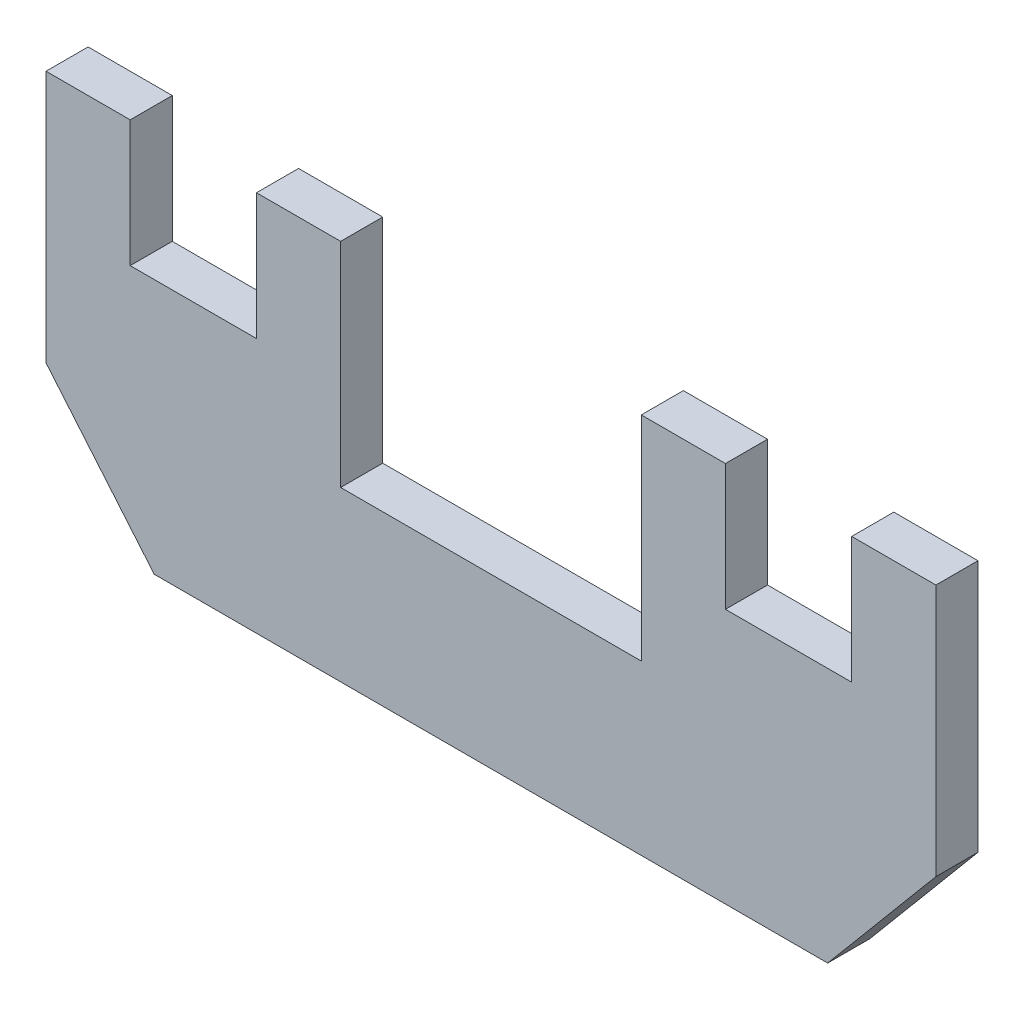
ISO-10303-21;
HEADER;
FILE_DESCRIPTION(('STEP AP214'),'2;1');
FILE_NAME('part.step','',(''),(''),'','','');
FILE_SCHEMA(('AUTOMOTIVE_DESIGN { 1 0 10303 214 1 1 1 1 }'));
ENDSEC;
DATA;
#1=APPLICATION_CONTEXT('core data for automotive mechanical design processes');
#2=APPLICATION_PROTOCOL_DEFINITION('international standard','automotive_design',2000,#1);
#3=PRODUCT_CONTEXT('',#1,'mechanical');
#4=PRODUCT('Part','Part','',(#3));
#5=PRODUCT_RELATED_PRODUCT_CATEGORY('part','',(#4));
#6=PRODUCT_DEFINITION_FORMATION('','',#4);
#7=PRODUCT_DEFINITION_CONTEXT('part definition',#1,'design');
#8=PRODUCT_DEFINITION('design','',#6,#7);
#9=PRODUCT_DEFINITION_SHAPE('','',#8);
#10=(LENGTH_UNIT() NAMED_UNIT(*) SI_UNIT(.MILLI.,.METRE.));
#11=(NAMED_UNIT(*) PLANE_ANGLE_UNIT() SI_UNIT($,.RADIAN.));
#12=(NAMED_UNIT(*) SI_UNIT($,.STERADIAN.) SOLID_ANGLE_UNIT());
#13=UNCERTAINTY_MEASURE_WITH_UNIT(LENGTH_MEASURE(1.E-05),#10,'distance_accuracy_value','');
#14=(GEOMETRIC_REPRESENTATION_CONTEXT(3) GLOBAL_UNCERTAINTY_ASSIGNED_CONTEXT((#13)) GLOBAL_UNIT_ASSIGNED_CONTEXT((#10,
#11,#12)) REPRESENTATION_CONTEXT('',''));
#15=CARTESIAN_POINT('',(0.,0.,0.));
#16=DIRECTION('',(0.,0.,1.));
#17=DIRECTION('',(1.,0.,0.));
#18=AXIS2_PLACEMENT_3D('',#15,#16,#17);
#19=CARTESIAN_POINT('',(50.8,0.,6.35));
#20=DIRECTION('',(-0.766044443118979,0.642787609686538,0.));
#21=DIRECTION('',(-0.642787609686538,-0.766044443118979,0.));
#22=AXIS2_PLACEMENT_3D('',#19,#20,#21);
#23=PLANE('',#22);
#24=DIRECTION('',(0.642787609686538,0.766044443118979,0.));
#25=VECTOR('',#24,1.);
#26=CARTESIAN_POINT('',(50.8,0.,0.));
#27=LINE('',#26,#25);
#28=CARTESIAN_POINT('',(50.8,0.,0.));
#29=VERTEX_POINT('',#28);
#30=CARTESIAN_POINT('',(67.1268052860381,19.4575288552221,0.));
#31=VERTEX_POINT('',#30);
#32=EDGE_CURVE('E200',#29,#31,#27,.T.);
#33=ORIENTED_EDGE('',*,*,#32,.T.);
#34=DIRECTION('',(0.,0.,-1.));
#35=VECTOR('',#34,1.);
#36=CARTESIAN_POINT('',(67.1268052860381,19.4575288552221,6.35));
#37=LINE('',#36,#35);
#38=CARTESIAN_POINT('',(67.1268052860381,19.4575288552221,6.35));
#39=VERTEX_POINT('',#38);
#40=EDGE_CURVE('E11',#39,#31,#37,.T.);
#41=ORIENTED_EDGE('',*,*,#40,.F.);
#42=DIRECTION('',(0.642787609686538,0.766044443118979,0.));
#43=VECTOR('',#42,1.);
#44=CARTESIAN_POINT('',(50.8,0.,6.35));
#45=LINE('',#44,#43);
#46=CARTESIAN_POINT('',(50.8,0.,6.35));
#47=VERTEX_POINT('',#46);
#48=EDGE_CURVE('E252',#47,#39,#45,.T.);
#49=ORIENTED_EDGE('',*,*,#48,.F.);
#50=DIRECTION('',(0.,0.,-1.));
#51=VECTOR('',#50,1.);
#52=CARTESIAN_POINT('',(50.8,0.,6.35));
#53=LINE('',#52,#51);
#54=EDGE_CURVE('E196',#47,#29,#53,.T.);
#55=ORIENTED_EDGE('',*,*,#54,.T.);
#56=EDGE_LOOP('',(#33,#41,#49,#55));
#57=FACE_BOUND('',#56,.T.);
#58=ADVANCED_FACE('F39',(#57),#23,.F.);
#59=CARTESIAN_POINT('',(67.1268052860381,19.4575288552221,6.35));
#60=DIRECTION('',(-1.,0.,0.));
#61=DIRECTION('',(0.,-1.,0.));
#62=AXIS2_PLACEMENT_3D('',#59,#60,#61);
#63=PLANE('',#62);
#64=DIRECTION('',(0.,1.,0.));
#65=VECTOR('',#64,1.);
#66=CARTESIAN_POINT('',(67.1268052860381,19.4575288552221,0.));
#67=LINE('',#66,#65);
#68=CARTESIAN_POINT('',(67.126805286038,57.5575288552221,0.));
#69=VERTEX_POINT('',#68);
#70=EDGE_CURVE('E204',#31,#69,#67,.T.);
#71=ORIENTED_EDGE('',*,*,#70,.T.);
#72=DIRECTION('',(0.,0.,-1.));
#73=VECTOR('',#72,1.);
#74=CARTESIAN_POINT('',(67.126805286038,57.5575288552221,6.35));
#75=LINE('',#74,#73);
#76=CARTESIAN_POINT('',(67.126805286038,57.5575288552221,6.35));
#77=VERTEX_POINT('',#76);
#78=EDGE_CURVE('E48',#77,#69,#75,.T.);
#79=ORIENTED_EDGE('',*,*,#78,.F.);
#80=DIRECTION('',(0.,1.,0.));
#81=VECTOR('',#80,1.);
#82=CARTESIAN_POINT('',(67.1268052860381,19.4575288552221,6.35));
#83=LINE('',#82,#81);
#84=EDGE_CURVE('E129',#39,#77,#83,.T.);
#85=ORIENTED_EDGE('',*,*,#84,.F.);
#86=ORIENTED_EDGE('',*,*,#40,.T.);
#87=EDGE_LOOP('',(#71,#79,#85,#86));
#88=FACE_BOUND('',#87,.T.);
#89=ADVANCED_FACE('F388',(#88),#63,.F.);
#90=CARTESIAN_POINT('',(67.126805286038,57.5575288552221,6.35));
#91=DIRECTION('',(0.,-1.,0.));
#92=DIRECTION('',(0.,0.,-1.));
#93=AXIS2_PLACEMENT_3D('',#90,#91,#92);
#94=PLANE('',#93);
#95=DIRECTION('',(-1.,0.,0.));
#96=VECTOR('',#95,1.);
#97=CARTESIAN_POINT('',(67.126805286038,57.5575288552221,0.));
#98=LINE('',#97,#96);
#99=CARTESIAN_POINT('',(54.426805286038,57.5575288552221,0.));
#100=VERTEX_POINT('',#99);
#101=EDGE_CURVE('E207',#69,#100,#98,.T.);
#102=ORIENTED_EDGE('',*,*,#101,.T.);
#103=DIRECTION('',(0.,0.,-1.));
#104=VECTOR('',#103,1.);
#105=CARTESIAN_POINT('',(54.426805286038,57.5575288552221,6.35));
#106=LINE('',#105,#104);
#107=CARTESIAN_POINT('',(54.426805286038,57.5575288552221,6.35));
#108=VERTEX_POINT('',#107);
#109=EDGE_CURVE('E303',#108,#100,#106,.T.);
#110=ORIENTED_EDGE('',*,*,#109,.F.);
#111=DIRECTION('',(-1.,0.,0.));
#112=VECTOR('',#111,1.);
#113=CARTESIAN_POINT('',(67.126805286038,57.5575288552221,6.35));
#114=LINE('',#113,#112);
#115=EDGE_CURVE('E313',#77,#108,#114,.T.);
#116=ORIENTED_EDGE('',*,*,#115,.F.);
#117=ORIENTED_EDGE('',*,*,#78,.T.);
#118=EDGE_LOOP('',(#102,#110,#116,#117));
#119=FACE_BOUND('',#118,.T.);
#120=ADVANCED_FACE('F311',(#119),#94,.F.);
#121=CARTESIAN_POINT('',(54.426805286038,57.5575288552221,6.35));
#122=DIRECTION('',(1.,0.,0.));
#123=DIRECTION('',(0.,1.,0.));
#124=AXIS2_PLACEMENT_3D('',#121,#122,#123);
#125=PLANE('',#124);
#126=DIRECTION('',(0.,-1.,0.));
#127=VECTOR('',#126,1.);
#128=CARTESIAN_POINT('',(54.426805286038,57.5575288552221,0.));
#129=LINE('',#128,#127);
#130=CARTESIAN_POINT('',(54.426805286038,38.5075288552221,0.));
#131=VERTEX_POINT('',#130);
#132=EDGE_CURVE('E210',#100,#131,#129,.T.);
#133=ORIENTED_EDGE('',*,*,#132,.T.);
#134=DIRECTION('',(0.,0.,-1.));
#135=VECTOR('',#134,1.);
#136=CARTESIAN_POINT('',(54.426805286038,38.5075288552221,6.35));
#137=LINE('',#136,#135);
#138=CARTESIAN_POINT('',(54.426805286038,38.5075288552221,6.35));
#139=VERTEX_POINT('',#138);
#140=EDGE_CURVE('E299',#139,#131,#137,.T.);
#141=ORIENTED_EDGE('',*,*,#140,.F.);
#142=DIRECTION('',(0.,-1.,0.));
#143=VECTOR('',#142,1.);
#144=CARTESIAN_POINT('',(54.426805286038,57.5575288552221,6.35));
#145=LINE('',#144,#143);
#146=EDGE_CURVE('E332',#108,#139,#145,.T.);
#147=ORIENTED_EDGE('',*,*,#146,.F.);
#148=ORIENTED_EDGE('',*,*,#109,.T.);
#149=EDGE_LOOP('',(#133,#141,#147,#148));
#150=FACE_BOUND('',#149,.T.);
#151=ADVANCED_FACE('F322',(#150),#125,.F.);
#152=CARTESIAN_POINT('',(54.426805286038,38.5075288552221,6.35));
#153=DIRECTION('',(0.,-1.,0.));
#154=DIRECTION('',(0.,0.,-1.));
#155=AXIS2_PLACEMENT_3D('',#152,#153,#154);
#156=PLANE('',#155);
#157=DIRECTION('',(-1.,0.,0.));
#158=VECTOR('',#157,1.);
#159=CARTESIAN_POINT('',(54.426805286038,38.5075288552221,0.));
#160=LINE('',#159,#158);
#161=CARTESIAN_POINT('',(35.376805286038,38.5075288552221,0.));
#162=VERTEX_POINT('',#161);
#163=EDGE_CURVE('E213',#131,#162,#160,.T.);
#164=ORIENTED_EDGE('',*,*,#163,.T.);
#165=DIRECTION('',(0.,0.,-1.));
#166=VECTOR('',#165,1.);
#167=CARTESIAN_POINT('',(35.376805286038,38.5075288552221,6.35));
#168=LINE('',#167,#166);
#169=CARTESIAN_POINT('',(35.376805286038,38.5075288552221,6.35));
#170=VERTEX_POINT('',#169);
#171=EDGE_CURVE('E295',#170,#162,#168,.T.);
#172=ORIENTED_EDGE('',*,*,#171,.F.);
#173=DIRECTION('',(-1.,0.,0.));
#174=VECTOR('',#173,1.);
#175=CARTESIAN_POINT('',(54.426805286038,38.5075288552221,6.35));
#176=LINE('',#175,#174);
#177=EDGE_CURVE('E328',#139,#170,#176,.T.);
#178=ORIENTED_EDGE('',*,*,#177,.F.);
#179=ORIENTED_EDGE('',*,*,#140,.T.);
#180=EDGE_LOOP('',(#164,#172,#178,#179));
#181=FACE_BOUND('',#180,.T.);
#182=ADVANCED_FACE('F326',(#181),#156,.F.);
#183=CARTESIAN_POINT('',(35.376805286038,38.5075288552221,6.35));
#184=DIRECTION('',(-1.,0.,0.));
#185=DIRECTION('',(0.,0.,1.));
#186=AXIS2_PLACEMENT_3D('',#183,#184,#185);
#187=PLANE('',#186);
#188=DIRECTION('',(0.,1.,0.));
#189=VECTOR('',#188,1.);
#190=CARTESIAN_POINT('',(35.376805286038,38.5075288552221,0.));
#191=LINE('',#190,#189);
#192=CARTESIAN_POINT('',(35.376805286038,57.5575288552221,0.));
#193=VERTEX_POINT('',#192);
#194=EDGE_CURVE('E216',#162,#193,#191,.T.);
#195=ORIENTED_EDGE('',*,*,#194,.T.);
#196=DIRECTION('',(0.,0.,-1.));
#197=VECTOR('',#196,1.);
#198=CARTESIAN_POINT('',(35.376805286038,57.5575288552221,6.35));
#199=LINE('',#198,#197);
#200=CARTESIAN_POINT('',(35.376805286038,57.5575288552221,6.35));
#201=VERTEX_POINT('',#200);
#202=EDGE_CURVE('E291',#201,#193,#199,.T.);
#203=ORIENTED_EDGE('',*,*,#202,.F.);
#204=DIRECTION('',(0.,1.,0.));
#205=VECTOR('',#204,1.);
#206=CARTESIAN_POINT('',(35.376805286038,38.5075288552221,6.35));
#207=LINE('',#206,#205);
#208=EDGE_CURVE('E331',#170,#201,#207,.T.);
#209=ORIENTED_EDGE('',*,*,#208,.F.);
#210=ORIENTED_EDGE('',*,*,#171,.T.);
#211=EDGE_LOOP('',(#195,#203,#209,#210));
#212=FACE_BOUND('',#211,.T.);
#213=ADVANCED_FACE('F401',(#212),#187,.F.);
#214=CARTESIAN_POINT('',(35.376805286038,57.5575288552221,6.35));
#215=DIRECTION('',(0.,-1.,0.));
#216=DIRECTION('',(0.,0.,-1.));
#217=AXIS2_PLACEMENT_3D('',#214,#215,#216);
#218=PLANE('',#217);
#219=DIRECTION('',(-1.,0.,0.));
#220=VECTOR('',#219,1.);
#221=CARTESIAN_POINT('',(35.376805286038,57.5575288552221,0.));
#222=LINE('',#221,#220);
#223=CARTESIAN_POINT('',(22.676805286038,57.5575288552221,0.));
#224=VERTEX_POINT('',#223);
#225=EDGE_CURVE('E219',#193,#224,#222,.T.);
#226=ORIENTED_EDGE('',*,*,#225,.T.);
#227=DIRECTION('',(0.,0.,-1.));
#228=VECTOR('',#227,1.);
#229=CARTESIAN_POINT('',(22.676805286038,57.5575288552221,6.35));
#230=LINE('',#229,#228);
#231=CARTESIAN_POINT('',(22.676805286038,57.5575288552221,6.35));
#232=VERTEX_POINT('',#231);
#233=EDGE_CURVE('E287',#232,#224,#230,.T.);
#234=ORIENTED_EDGE('',*,*,#233,.F.);
#235=DIRECTION('',(-1.,0.,0.));
#236=VECTOR('',#235,1.);
#237=CARTESIAN_POINT('',(35.376805286038,57.5575288552221,6.35));
#238=LINE('',#237,#236);
#239=EDGE_CURVE('E336',#201,#232,#238,.T.);
#240=ORIENTED_EDGE('',*,*,#239,.F.);
#241=ORIENTED_EDGE('',*,*,#202,.T.);
#242=EDGE_LOOP('',(#226,#234,#240,#241));
#243=FACE_BOUND('',#242,.T.);
#244=ADVANCED_FACE('F404',(#243),#218,.F.);
#245=CARTESIAN_POINT('',(22.676805286038,57.5575288552221,6.35));
#246=DIRECTION('',(1.,0.,0.));
#247=DIRECTION('',(0.,1.,0.));
#248=AXIS2_PLACEMENT_3D('',#245,#246,#247);
#249=PLANE('',#248);
#250=DIRECTION('',(0.,-1.,0.));
#251=VECTOR('',#250,1.);
#252=CARTESIAN_POINT('',(22.676805286038,57.5575288552221,0.));
#253=LINE('',#252,#251);
#254=CARTESIAN_POINT('',(22.676805286038,25.4,0.));
#255=VERTEX_POINT('',#254);
#256=EDGE_CURVE('E222',#224,#255,#253,.T.);
#257=ORIENTED_EDGE('',*,*,#256,.T.);
#258=DIRECTION('',(0.,0.,-1.));
#259=VECTOR('',#258,1.);
#260=CARTESIAN_POINT('',(22.676805286038,25.4,6.35));
#261=LINE('',#260,#259);
#262=CARTESIAN_POINT('',(22.676805286038,25.4,6.35));
#263=VERTEX_POINT('',#262);
#264=EDGE_CURVE('E283',#263,#255,#261,.T.);
#265=ORIENTED_EDGE('',*,*,#264,.F.);
#266=DIRECTION('',(0.,-1.,0.));
#267=VECTOR('',#266,1.);
#268=CARTESIAN_POINT('',(22.676805286038,57.5575288552221,6.35));
#269=LINE('',#268,#267);
#270=EDGE_CURVE('E343',#232,#263,#269,.T.);
#271=ORIENTED_EDGE('',*,*,#270,.F.);
#272=ORIENTED_EDGE('',*,*,#233,.T.);
#273=EDGE_LOOP('',(#257,#265,#271,#272));
#274=FACE_BOUND('',#273,.T.);
#275=ADVANCED_FACE('F408',(#274),#249,.F.);
#276=CARTESIAN_POINT('',(22.676805286038,25.4,6.35));
#277=DIRECTION('',(0.,-1.,0.));
#278=DIRECTION('',(0.,0.,-1.));
#279=AXIS2_PLACEMENT_3D('',#276,#277,#278);
#280=PLANE('',#279);
#281=DIRECTION('',(-1.,0.,0.));
#282=VECTOR('',#281,1.);
#283=CARTESIAN_POINT('',(22.676805286038,25.4,0.));
#284=LINE('',#283,#282);
#285=CARTESIAN_POINT('',(-22.676805286038,25.4,0.));
#286=VERTEX_POINT('',#285);
#287=EDGE_CURVE('E225',#255,#286,#284,.T.);
#288=ORIENTED_EDGE('',*,*,#287,.T.);
#289=DIRECTION('',(0.,0.,-1.));
#290=VECTOR('',#289,1.);
#291=CARTESIAN_POINT('',(-22.676805286038,25.4,6.35));
#292=LINE('',#291,#290);
#293=CARTESIAN_POINT('',(-22.676805286038,25.4,6.35));
#294=VERTEX_POINT('',#293);
#295=EDGE_CURVE('E279',#294,#286,#292,.T.);
#296=ORIENTED_EDGE('',*,*,#295,.F.);
#297=DIRECTION('',(-1.,0.,0.));
#298=VECTOR('',#297,1.);
#299=CARTESIAN_POINT('',(22.676805286038,25.4,6.35));
#300=LINE('',#299,#298);
#301=EDGE_CURVE('E346',#263,#294,#300,.T.);
#302=ORIENTED_EDGE('',*,*,#301,.F.);
#303=ORIENTED_EDGE('',*,*,#264,.T.);
#304=EDGE_LOOP('',(#288,#296,#302,#303));
#305=FACE_BOUND('',#304,.T.);
#306=ADVANCED_FACE('F412',(#305),#280,.F.);
#307=CARTESIAN_POINT('',(-22.676805286038,57.5575288552221,6.35));
#308=DIRECTION('',(-1.,0.,0.));
#309=DIRECTION('',(0.,-1.,0.));
#310=AXIS2_PLACEMENT_3D('',#307,#308,#309);
#311=PLANE('',#310);
#312=DIRECTION('',(0.,1.,0.));
#313=VECTOR('',#312,1.);
#314=CARTESIAN_POINT('',(-22.676805286038,57.5575288552221,0.));
#315=LINE('',#314,#313);
#316=CARTESIAN_POINT('',(-22.676805286038,57.5575288552221,0.));
#317=VERTEX_POINT('',#316);
#318=EDGE_CURVE('E228',#286,#317,#315,.T.);
#319=ORIENTED_EDGE('',*,*,#318,.T.);
#320=DIRECTION('',(0.,0.,-1.));
#321=VECTOR('',#320,1.);
#322=CARTESIAN_POINT('',(-22.676805286038,57.5575288552221,6.35));
#323=LINE('',#322,#321);
#324=CARTESIAN_POINT('',(-22.676805286038,57.5575288552221,6.35));
#325=VERTEX_POINT('',#324);
#326=EDGE_CURVE('E275',#325,#317,#323,.T.);
#327=ORIENTED_EDGE('',*,*,#326,.F.);
#328=DIRECTION('',(0.,1.,0.));
#329=VECTOR('',#328,1.);
#330=CARTESIAN_POINT('',(-22.676805286038,57.5575288552221,6.35));
#331=LINE('',#330,#329);
#332=EDGE_CURVE('E349',#294,#325,#331,.T.);
#333=ORIENTED_EDGE('',*,*,#332,.F.);
#334=ORIENTED_EDGE('',*,*,#295,.T.);
#335=EDGE_LOOP('',(#319,#327,#333,#334));
#336=FACE_BOUND('',#335,.T.);
#337=ADVANCED_FACE('F416',(#336),#311,.F.);
#338=CARTESIAN_POINT('',(-35.376805286038,57.5575288552221,6.35));
#339=DIRECTION('',(0.,-1.,0.));
#340=DIRECTION('',(0.,0.,-1.));
#341=AXIS2_PLACEMENT_3D('',#338,#339,#340);
#342=PLANE('',#341);
#343=DIRECTION('',(-1.,0.,0.));
#344=VECTOR('',#343,1.);
#345=CARTESIAN_POINT('',(-35.376805286038,57.5575288552221,0.));
#346=LINE('',#345,#344);
#347=CARTESIAN_POINT('',(-35.376805286038,57.5575288552221,0.));
#348=VERTEX_POINT('',#347);
#349=EDGE_CURVE('E231',#317,#348,#346,.T.);
#350=ORIENTED_EDGE('',*,*,#349,.T.);
#351=DIRECTION('',(0.,0.,-1.));
#352=VECTOR('',#351,1.);
#353=CARTESIAN_POINT('',(-35.376805286038,57.5575288552221,6.35));
#354=LINE('',#353,#352);
#355=CARTESIAN_POINT('',(-35.376805286038,57.5575288552221,6.35));
#356=VERTEX_POINT('',#355);
#357=EDGE_CURVE('E271',#356,#348,#354,.T.);
#358=ORIENTED_EDGE('',*,*,#357,.F.);
#359=DIRECTION('',(-1.,0.,0.));
#360=VECTOR('',#359,1.);
#361=CARTESIAN_POINT('',(-35.376805286038,57.5575288552221,6.35));
#362=LINE('',#361,#360);
#363=EDGE_CURVE('E352',#325,#356,#362,.T.);
#364=ORIENTED_EDGE('',*,*,#363,.F.);
#365=ORIENTED_EDGE('',*,*,#326,.T.);
#366=EDGE_LOOP('',(#350,#358,#364,#365));
#367=FACE_BOUND('',#366,.T.);
#368=ADVANCED_FACE('F420',(#367),#342,.F.);
#369=CARTESIAN_POINT('',(-35.376805286038,38.5075288552221,6.35));
#370=DIRECTION('',(1.,0.,0.));
#371=DIRECTION('',(0.,0.,-1.));
#372=AXIS2_PLACEMENT_3D('',#369,#370,#371);
#373=PLANE('',#372);
#374=DIRECTION('',(0.,-1.,0.));
#375=VECTOR('',#374,1.);
#376=CARTESIAN_POINT('',(-35.376805286038,38.5075288552221,0.));
#377=LINE('',#376,#375);
#378=CARTESIAN_POINT('',(-35.376805286038,38.5075288552221,0.));
#379=VERTEX_POINT('',#378);
#380=EDGE_CURVE('E234',#348,#379,#377,.T.);
#381=ORIENTED_EDGE('',*,*,#380,.T.);
#382=DIRECTION('',(0.,0.,-1.));
#383=VECTOR('',#382,1.);
#384=CARTESIAN_POINT('',(-35.376805286038,38.5075288552221,6.35));
#385=LINE('',#384,#383);
#386=CARTESIAN_POINT('',(-35.376805286038,38.5075288552221,6.35));
#387=VERTEX_POINT('',#386);
#388=EDGE_CURVE('E267',#387,#379,#385,.T.);
#389=ORIENTED_EDGE('',*,*,#388,.F.);
#390=DIRECTION('',(0.,-1.,0.));
#391=VECTOR('',#390,1.);
#392=CARTESIAN_POINT('',(-35.376805286038,38.5075288552221,6.35));
#393=LINE('',#392,#391);
#394=EDGE_CURVE('E355',#356,#387,#393,.T.);
#395=ORIENTED_EDGE('',*,*,#394,.F.);
#396=ORIENTED_EDGE('',*,*,#357,.T.);
#397=EDGE_LOOP('',(#381,#389,#395,#396));
#398=FACE_BOUND('',#397,.T.);
#399=ADVANCED_FACE('F424',(#398),#373,.F.);
#400=CARTESIAN_POINT('',(-54.426805286038,38.5075288552221,6.35));
#401=DIRECTION('',(0.,-1.,0.));
#402=DIRECTION('',(0.,0.,-1.));
#403=AXIS2_PLACEMENT_3D('',#400,#401,#402);
#404=PLANE('',#403);
#405=DIRECTION('',(-1.,0.,0.));
#406=VECTOR('',#405,1.);
#407=CARTESIAN_POINT('',(-54.426805286038,38.5075288552221,0.));
#408=LINE('',#407,#406);
#409=CARTESIAN_POINT('',(-54.426805286038,38.5075288552221,0.));
#410=VERTEX_POINT('',#409);
#411=EDGE_CURVE('E237',#379,#410,#408,.T.);
#412=ORIENTED_EDGE('',*,*,#411,.T.);
#413=DIRECTION('',(0.,0.,-1.));
#414=VECTOR('',#413,1.);
#415=CARTESIAN_POINT('',(-54.426805286038,38.5075288552221,6.35));
#416=LINE('',#415,#414);
#417=CARTESIAN_POINT('',(-54.426805286038,38.5075288552221,6.35));
#418=VERTEX_POINT('',#417);
#419=EDGE_CURVE('E263',#418,#410,#416,.T.);
#420=ORIENTED_EDGE('',*,*,#419,.F.);
#421=DIRECTION('',(-1.,0.,0.));
#422=VECTOR('',#421,1.);
#423=CARTESIAN_POINT('',(-54.426805286038,38.5075288552221,6.35));
#424=LINE('',#423,#422);
#425=EDGE_CURVE('E358',#387,#418,#424,.T.);
#426=ORIENTED_EDGE('',*,*,#425,.F.);
#427=ORIENTED_EDGE('',*,*,#388,.T.);
#428=EDGE_LOOP('',(#412,#420,#426,#427));
#429=FACE_BOUND('',#428,.T.);
#430=ADVANCED_FACE('F428',(#429),#404,.F.);
#431=CARTESIAN_POINT('',(-54.426805286038,57.5575288552221,6.35));
#432=DIRECTION('',(-1.,0.,0.));
#433=DIRECTION('',(0.,-1.,0.));
#434=AXIS2_PLACEMENT_3D('',#431,#432,#433);
#435=PLANE('',#434);
#436=DIRECTION('',(0.,1.,0.));
#437=VECTOR('',#436,1.);
#438=CARTESIAN_POINT('',(-54.426805286038,57.5575288552221,0.));
#439=LINE('',#438,#437);
#440=CARTESIAN_POINT('',(-54.426805286038,57.5575288552221,0.));
#441=VERTEX_POINT('',#440);
#442=EDGE_CURVE('E240',#410,#441,#439,.T.);
#443=ORIENTED_EDGE('',*,*,#442,.T.);
#444=DIRECTION('',(0.,0.,-1.));
#445=VECTOR('',#444,1.);
#446=CARTESIAN_POINT('',(-54.426805286038,57.5575288552221,6.35));
#447=LINE('',#446,#445);
#448=CARTESIAN_POINT('',(-54.426805286038,57.5575288552221,6.35));
#449=VERTEX_POINT('',#448);
#450=EDGE_CURVE('E259',#449,#441,#447,.T.);
#451=ORIENTED_EDGE('',*,*,#450,.F.);
#452=DIRECTION('',(0.,1.,0.));
#453=VECTOR('',#452,1.);
#454=CARTESIAN_POINT('',(-54.426805286038,57.5575288552221,6.35));
#455=LINE('',#454,#453);
#456=EDGE_CURVE('E361',#418,#449,#455,.T.);
#457=ORIENTED_EDGE('',*,*,#456,.F.);
#458=ORIENTED_EDGE('',*,*,#419,.T.);
#459=EDGE_LOOP('',(#443,#451,#457,#458));
#460=FACE_BOUND('',#459,.T.);
#461=ADVANCED_FACE('F369',(#460),#435,.F.);
#462=CARTESIAN_POINT('',(-67.126805286038,57.5575288552221,6.35));
#463=DIRECTION('',(0.,-1.,0.));
#464=DIRECTION('',(0.,0.,-1.));
#465=AXIS2_PLACEMENT_3D('',#462,#463,#464);
#466=PLANE('',#465);
#467=DIRECTION('',(-1.,0.,0.));
#468=VECTOR('',#467,1.);
#469=CARTESIAN_POINT('',(-67.126805286038,57.5575288552221,0.));
#470=LINE('',#469,#468);
#471=CARTESIAN_POINT('',(-67.126805286038,57.5575288552221,0.));
#472=VERTEX_POINT('',#471);
#473=EDGE_CURVE('E243',#441,#472,#470,.T.);
#474=ORIENTED_EDGE('',*,*,#473,.T.);
#475=DIRECTION('',(0.,0.,-1.));
#476=VECTOR('',#475,1.);
#477=CARTESIAN_POINT('',(-67.126805286038,57.5575288552221,6.35));
#478=LINE('',#477,#476);
#479=CARTESIAN_POINT('',(-67.126805286038,57.5575288552221,6.35));
#480=VERTEX_POINT('',#479);
#481=EDGE_CURVE('E189',#480,#472,#478,.T.);
#482=ORIENTED_EDGE('',*,*,#481,.F.);
#483=DIRECTION('',(-1.,0.,0.));
#484=VECTOR('',#483,1.);
#485=CARTESIAN_POINT('',(-67.126805286038,57.5575288552221,6.35));
#486=LINE('',#485,#484);
#487=EDGE_CURVE('E178',#449,#480,#486,.T.);
#488=ORIENTED_EDGE('',*,*,#487,.F.);
#489=ORIENTED_EDGE('',*,*,#450,.T.);
#490=EDGE_LOOP('',(#474,#482,#488,#489));
#491=FACE_BOUND('',#490,.T.);
#492=ADVANCED_FACE('F373',(#491),#466,.F.);
#493=CARTESIAN_POINT('',(-67.1268052860381,19.4575288552221,6.35));
#494=DIRECTION('',(1.,0.,0.));
#495=DIRECTION('',(0.,1.,0.));
#496=AXIS2_PLACEMENT_3D('',#493,#494,#495);
#497=PLANE('',#496);
#498=DIRECTION('',(0.,-1.,0.));
#499=VECTOR('',#498,1.);
#500=CARTESIAN_POINT('',(-67.1268052860381,19.4575288552221,0.));
#501=LINE('',#500,#499);
#502=CARTESIAN_POINT('',(-67.1268052860381,19.4575288552221,0.));
#503=VERTEX_POINT('',#502);
#504=EDGE_CURVE('E187',#472,#503,#501,.T.);
#505=ORIENTED_EDGE('',*,*,#504,.T.);
#506=DIRECTION('',(0.,0.,-1.));
#507=VECTOR('',#506,1.);
#508=CARTESIAN_POINT('',(-67.1268052860381,19.4575288552221,6.35));
#509=LINE('',#508,#507);
#510=CARTESIAN_POINT('',(-67.1268052860381,19.4575288552221,6.35));
#511=VERTEX_POINT('',#510);
#512=EDGE_CURVE('E184',#511,#503,#509,.T.);
#513=ORIENTED_EDGE('',*,*,#512,.F.);
#514=DIRECTION('',(0.,-1.,0.));
#515=VECTOR('',#514,1.);
#516=CARTESIAN_POINT('',(-67.1268052860381,19.4575288552221,6.35));
#517=LINE('',#516,#515);
#518=EDGE_CURVE('E172',#480,#511,#517,.T.);
#519=ORIENTED_EDGE('',*,*,#518,.F.);
#520=ORIENTED_EDGE('',*,*,#481,.T.);
#521=EDGE_LOOP('',(#505,#513,#519,#520));
#522=FACE_BOUND('',#521,.T.);
#523=ADVANCED_FACE('F185',(#522),#497,.F.);
#524=CARTESIAN_POINT('',(-50.8,0.,6.35));
#525=DIRECTION('',(0.766044443118979,0.642787609686538,0.));
#526=DIRECTION('',(-0.642787609686538,0.766044443118979,0.));
#527=AXIS2_PLACEMENT_3D('',#524,#525,#526);
#528=PLANE('',#527);
#529=DIRECTION('',(0.642787609686538,-0.766044443118979,0.));
#530=VECTOR('',#529,1.);
#531=CARTESIAN_POINT('',(-50.8,0.,0.));
#532=LINE('',#531,#530);
#533=CARTESIAN_POINT('',(-50.8,0.,0.));
#534=VERTEX_POINT('',#533);
#535=EDGE_CURVE('E115',#503,#534,#532,.T.);
#536=ORIENTED_EDGE('',*,*,#535,.T.);
#537=DIRECTION('',(0.,0.,-1.));
#538=VECTOR('',#537,1.);
#539=CARTESIAN_POINT('',(-50.8,0.,6.35));
#540=LINE('',#539,#538);
#541=CARTESIAN_POINT('',(-50.8,0.,6.35));
#542=VERTEX_POINT('',#541);
#543=EDGE_CURVE('E190',#542,#534,#540,.T.);
#544=ORIENTED_EDGE('',*,*,#543,.F.);
#545=DIRECTION('',(0.642787609686538,-0.766044443118979,0.));
#546=VECTOR('',#545,1.);
#547=CARTESIAN_POINT('',(-50.8,0.,6.35));
#548=LINE('',#547,#546);
#549=EDGE_CURVE('E176',#511,#542,#548,.T.);
#550=ORIENTED_EDGE('',*,*,#549,.F.);
#551=ORIENTED_EDGE('',*,*,#512,.T.);
#552=EDGE_LOOP('',(#536,#544,#550,#551));
#553=FACE_BOUND('',#552,.T.);
#554=ADVANCED_FACE('F192',(#553),#528,.F.);
#555=CARTESIAN_POINT('',(-50.8,0.,6.35));
#556=DIRECTION('',(0.,1.,0.));
#557=DIRECTION('',(0.,0.,1.));
#558=AXIS2_PLACEMENT_3D('',#555,#556,#557);
#559=PLANE('',#558);
#560=DIRECTION('',(1.,0.,0.));
#561=VECTOR('',#560,1.);
#562=CARTESIAN_POINT('',(-50.8,0.,0.));
#563=LINE('',#562,#561);
#564=EDGE_CURVE('E121',#534,#29,#563,.T.);
#565=ORIENTED_EDGE('',*,*,#564,.T.);
#566=ORIENTED_EDGE('',*,*,#54,.F.);
#567=DIRECTION('',(1.,0.,0.));
#568=VECTOR('',#567,1.);
#569=CARTESIAN_POINT('',(-50.8,0.,6.35));
#570=LINE('',#569,#568);
#571=EDGE_CURVE('E56',#542,#47,#570,.T.);
#572=ORIENTED_EDGE('',*,*,#571,.F.);
#573=ORIENTED_EDGE('',*,*,#543,.T.);
#574=EDGE_LOOP('',(#565,#566,#572,#573));
#575=FACE_BOUND('',#574,.T.);
#576=ADVANCED_FACE('F377',(#575),#559,.F.);
#577=CARTESIAN_POINT('',(0.,0.,6.35));
#578=DIRECTION('',(0.,0.,1.));
#579=DIRECTION('',(1.,0.,0.));
#580=AXIS2_PLACEMENT_3D('',#577,#578,#579);
#581=PLANE('',#580);
#582=ORIENTED_EDGE('',*,*,#48,.T.);
#583=ORIENTED_EDGE('',*,*,#84,.T.);
#584=ORIENTED_EDGE('',*,*,#115,.T.);
#585=ORIENTED_EDGE('',*,*,#146,.T.);
#586=ORIENTED_EDGE('',*,*,#177,.T.);
#587=ORIENTED_EDGE('',*,*,#208,.T.);
#588=ORIENTED_EDGE('',*,*,#239,.T.);
#589=ORIENTED_EDGE('',*,*,#270,.T.);
#590=ORIENTED_EDGE('',*,*,#301,.T.);
#591=ORIENTED_EDGE('',*,*,#332,.T.);
#592=ORIENTED_EDGE('',*,*,#363,.T.);
#593=ORIENTED_EDGE('',*,*,#394,.T.);
#594=ORIENTED_EDGE('',*,*,#425,.T.);
#595=ORIENTED_EDGE('',*,*,#456,.T.);
#596=ORIENTED_EDGE('',*,*,#487,.T.);
#597=ORIENTED_EDGE('',*,*,#518,.T.);
#598=ORIENTED_EDGE('',*,*,#549,.T.);
#599=ORIENTED_EDGE('',*,*,#571,.T.);
#600=EDGE_LOOP('',(#582,#583,#584,#585,#586,#587,#588,#589,#590,#591,#592,#593,#594,#595,#596,
#597,#598,#599));
#601=FACE_BOUND('',#600,.T.);
#602=ADVANCED_FACE('F174',(#601),#581,.T.);
#603=CARTESIAN_POINT('',(0.,0.,0.));
#604=DIRECTION('',(0.,0.,1.));
#605=DIRECTION('',(1.,0.,0.));
#606=AXIS2_PLACEMENT_3D('',#603,#604,#605);
#607=PLANE('',#606);
#608=ORIENTED_EDGE('',*,*,#32,.F.);
#609=ORIENTED_EDGE('',*,*,#564,.F.);
#610=ORIENTED_EDGE('',*,*,#535,.F.);
#611=ORIENTED_EDGE('',*,*,#504,.F.);
#612=ORIENTED_EDGE('',*,*,#473,.F.);
#613=ORIENTED_EDGE('',*,*,#442,.F.);
#614=ORIENTED_EDGE('',*,*,#411,.F.);
#615=ORIENTED_EDGE('',*,*,#380,.F.);
#616=ORIENTED_EDGE('',*,*,#349,.F.);
#617=ORIENTED_EDGE('',*,*,#318,.F.);
#618=ORIENTED_EDGE('',*,*,#287,.F.);
#619=ORIENTED_EDGE('',*,*,#256,.F.);
#620=ORIENTED_EDGE('',*,*,#225,.F.);
#621=ORIENTED_EDGE('',*,*,#194,.F.);
#622=ORIENTED_EDGE('',*,*,#163,.F.);
#623=ORIENTED_EDGE('',*,*,#132,.F.);
#624=ORIENTED_EDGE('',*,*,#101,.F.);
#625=ORIENTED_EDGE('',*,*,#70,.F.);
#626=EDGE_LOOP('',(#608,#609,#610,#611,#612,#613,#614,#615,#616,#617,#618,#619,#620,#621,#622,
#623,#624,#625));
#627=FACE_BOUND('',#626,.T.);
#628=ADVANCED_FACE('F317',(#627),#607,.F.);
#629=CLOSED_SHELL('',(#58,#89,#120,#151,#182,#213,#244,#275,#306,#337,#368,#399,#430,#461,#492,
#523,#554,#576,#602,#628));
#630=MANIFOLD_SOLID_BREP('B2',#629);
#631=ADVANCED_BREP_SHAPE_REPRESENTATION('',(#18,#630),#14);
#632=SHAPE_DEFINITION_REPRESENTATION(#9,#631);
ENDSEC;
END-ISO-10303-21;
